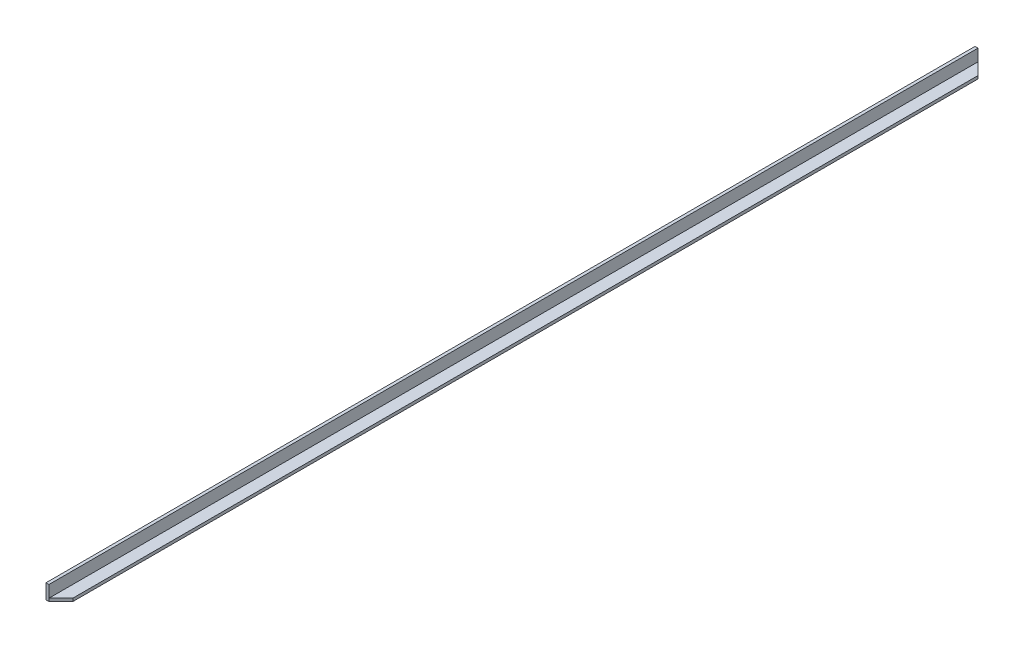
ISO-10303-21;
HEADER;
FILE_DESCRIPTION(('STEP AP214'),'2;1');
FILE_NAME('part.step','',(''),(''),'','','');
FILE_SCHEMA(('AUTOMOTIVE_DESIGN { 1 0 10303 214 1 1 1 1 }'));
ENDSEC;
DATA;
#1=APPLICATION_CONTEXT('core data for automotive mechanical design processes');
#2=APPLICATION_PROTOCOL_DEFINITION('international standard','automotive_design',2000,#1);
#3=PRODUCT_CONTEXT('',#1,'mechanical');
#4=PRODUCT('Part','Part','',(#3));
#5=PRODUCT_RELATED_PRODUCT_CATEGORY('part','',(#4));
#6=PRODUCT_DEFINITION_FORMATION('','',#4);
#7=PRODUCT_DEFINITION_CONTEXT('part definition',#1,'design');
#8=PRODUCT_DEFINITION('design','',#6,#7);
#9=PRODUCT_DEFINITION_SHAPE('','',#8);
#10=(LENGTH_UNIT() NAMED_UNIT(*) SI_UNIT(.MILLI.,.METRE.));
#11=(NAMED_UNIT(*) PLANE_ANGLE_UNIT() SI_UNIT($,.RADIAN.));
#12=(NAMED_UNIT(*) SI_UNIT($,.STERADIAN.) SOLID_ANGLE_UNIT());
#13=UNCERTAINTY_MEASURE_WITH_UNIT(LENGTH_MEASURE(1.E-05),#10,'distance_accuracy_value','');
#14=(GEOMETRIC_REPRESENTATION_CONTEXT(3) GLOBAL_UNCERTAINTY_ASSIGNED_CONTEXT((#13)) GLOBAL_UNIT_ASSIGNED_CONTEXT((#10,
#11,#12)) REPRESENTATION_CONTEXT('',''));
#15=CARTESIAN_POINT('',(0.,0.,0.));
#16=DIRECTION('',(0.,0.,1.));
#17=DIRECTION('',(1.,0.,0.));
#18=AXIS2_PLACEMENT_3D('',#15,#16,#17);
#19=CARTESIAN_POINT('',(-10.,0.,1250.));
#20=DIRECTION('',(1.,0.,0.));
#21=DIRECTION('',(0.,1.,0.));
#22=AXIS2_PLACEMENT_3D('',#19,#20,#21);
#23=PLANE('',#22);
#24=DIRECTION('',(0.,-1.,0.));
#25=VECTOR('',#24,1.);
#26=CARTESIAN_POINT('',(-10.,0.,0.));
#27=LINE('',#26,#25);
#28=CARTESIAN_POINT('',(-9.99999999999999,20.,0.));
#29=VERTEX_POINT('',#28);
#30=CARTESIAN_POINT('',(-10.,0.,0.));
#31=VERTEX_POINT('',#30);
#32=EDGE_CURVE('E133',#29,#31,#27,.T.);
#33=ORIENTED_EDGE('',*,*,#32,.T.);
#34=DIRECTION('',(0.,0.,-1.));
#35=VECTOR('',#34,1.);
#36=CARTESIAN_POINT('',(-10.,0.,1250.));
#37=LINE('',#36,#35);
#38=CARTESIAN_POINT('',(-10.,0.,1250.));
#39=VERTEX_POINT('',#38);
#40=EDGE_CURVE('E11',#39,#31,#37,.T.);
#41=ORIENTED_EDGE('',*,*,#40,.F.);
#42=DIRECTION('',(0.,-1.,0.));
#43=VECTOR('',#42,1.);
#44=CARTESIAN_POINT('',(-10.,0.,1250.));
#45=LINE('',#44,#43);
#46=CARTESIAN_POINT('',(-9.99999999999999,20.,1250.));
#47=VERTEX_POINT('',#46);
#48=EDGE_CURVE('E128',#47,#39,#45,.T.);
#49=ORIENTED_EDGE('',*,*,#48,.F.);
#50=DIRECTION('',(0.,0.,-1.));
#51=VECTOR('',#50,1.);
#52=CARTESIAN_POINT('',(-9.99999999999999,20.,1250.));
#53=LINE('',#52,#51);
#54=EDGE_CURVE('E125',#47,#29,#53,.T.);
#55=ORIENTED_EDGE('',*,*,#54,.T.);
#56=EDGE_LOOP('',(#33,#41,#49,#55));
#57=FACE_BOUND('',#56,.T.);
#58=ADVANCED_FACE('F33',(#57),#23,.F.);
#59=CARTESIAN_POINT('',(-10.,0.,1250.));
#60=DIRECTION('',(0.,1.,0.));
#61=DIRECTION('',(-1.,0.,0.));
#62=AXIS2_PLACEMENT_3D('',#59,#60,#61);
#63=PLANE('',#62);
#64=DIRECTION('',(0.,0.,-1.));
#65=VECTOR('',#64,1.);
#66=CARTESIAN_POINT('',(10.,0.,1250.));
#67=LINE('',#66,#65);
#68=CARTESIAN_POINT('',(10.,0.,1234.));
#69=VERTEX_POINT('',#68);
#70=CARTESIAN_POINT('',(10.,0.,16.));
#71=VERTEX_POINT('',#70);
#72=EDGE_CURVE('E40',#69,#71,#67,.T.);
#73=ORIENTED_EDGE('',*,*,#72,.F.);
#74=DIRECTION('',(-0.707106781186547,0.,0.707106781186548));
#75=VECTOR('',#74,1.);
#76=CARTESIAN_POINT('',(-6.,0.,1250.));
#77=LINE('',#76,#75);
#78=CARTESIAN_POINT('',(-6.,0.,1250.));
#79=VERTEX_POINT('',#78);
#80=EDGE_CURVE('E100',#69,#79,#77,.T.);
#81=ORIENTED_EDGE('',*,*,#80,.T.);
#82=DIRECTION('',(1.,0.,0.));
#83=VECTOR('',#82,1.);
#84=CARTESIAN_POINT('',(-10.,0.,1250.));
#85=LINE('',#84,#83);
#86=EDGE_CURVE('E81',#39,#79,#85,.T.);
#87=ORIENTED_EDGE('',*,*,#86,.F.);
#88=ORIENTED_EDGE('',*,*,#40,.T.);
#89=DIRECTION('',(1.,0.,0.));
#90=VECTOR('',#89,1.);
#91=CARTESIAN_POINT('',(-10.,0.,0.));
#92=LINE('',#91,#90);
#93=CARTESIAN_POINT('',(-6.,0.,0.));
#94=VERTEX_POINT('',#93);
#95=EDGE_CURVE('E131',#31,#94,#92,.T.);
#96=ORIENTED_EDGE('',*,*,#95,.T.);
#97=DIRECTION('',(0.707106781186548,0.,0.707106781186548));
#98=VECTOR('',#97,1.);
#99=CARTESIAN_POINT('',(-6.,0.,0.));
#100=LINE('',#99,#98);
#101=EDGE_CURVE('E47',#94,#71,#100,.T.);
#102=ORIENTED_EDGE('',*,*,#101,.T.);
#103=EDGE_LOOP('',(#73,#81,#87,#88,#96,#102));
#104=FACE_BOUND('',#103,.T.);
#105=ADVANCED_FACE('F116',(#104),#63,.F.);
#106=CARTESIAN_POINT('',(10.,4.,1250.));
#107=DIRECTION('',(-1.,0.,0.));
#108=DIRECTION('',(0.,0.,1.));
#109=AXIS2_PLACEMENT_3D('',#106,#107,#108);
#110=PLANE('',#109);
#111=DIRECTION('',(0.,0.,-1.));
#112=VECTOR('',#111,1.);
#113=CARTESIAN_POINT('',(10.,4.,1250.));
#114=LINE('',#113,#112);
#115=CARTESIAN_POINT('',(10.,4.,1234.));
#116=VERTEX_POINT('',#115);
#117=CARTESIAN_POINT('',(10.,4.,16.));
#118=VERTEX_POINT('',#117);
#119=EDGE_CURVE('E114',#116,#118,#114,.T.);
#120=ORIENTED_EDGE('',*,*,#119,.F.);
#121=DIRECTION('',(0.,1.,0.));
#122=VECTOR('',#121,1.);
#123=CARTESIAN_POINT('',(10.,0.,1234.));
#124=LINE('',#123,#122);
#125=EDGE_CURVE('E103',#69,#116,#124,.T.);
#126=ORIENTED_EDGE('',*,*,#125,.F.);
#127=ORIENTED_EDGE('',*,*,#72,.T.);
#128=DIRECTION('',(0.,1.,0.));
#129=VECTOR('',#128,1.);
#130=CARTESIAN_POINT('',(10.,0.,16.));
#131=LINE('',#130,#129);
#132=EDGE_CURVE('E136',#71,#118,#131,.T.);
#133=ORIENTED_EDGE('',*,*,#132,.T.);
#134=EDGE_LOOP('',(#120,#126,#127,#133));
#135=FACE_BOUND('',#134,.T.);
#136=ADVANCED_FACE('F112',(#135),#110,.F.);
#137=CARTESIAN_POINT('',(-6.,4.,1250.));
#138=DIRECTION('',(0.,-1.,0.));
#139=DIRECTION('',(0.,0.,-1.));
#140=AXIS2_PLACEMENT_3D('',#137,#138,#139);
#141=PLANE('',#140);
#142=DIRECTION('',(0.,0.,-1.));
#143=VECTOR('',#142,1.);
#144=CARTESIAN_POINT('',(-6.,4.,1250.));
#145=LINE('',#144,#143);
#146=CARTESIAN_POINT('',(-6.,4.,1250.));
#147=VERTEX_POINT('',#146);
#148=CARTESIAN_POINT('',(-6.,4.,0.));
#149=VERTEX_POINT('',#148);
#150=EDGE_CURVE('E118',#147,#149,#145,.T.);
#151=ORIENTED_EDGE('',*,*,#150,.F.);
#152=DIRECTION('',(-0.707106781186547,0.,0.707106781186548));
#153=VECTOR('',#152,1.);
#154=CARTESIAN_POINT('',(-6.,4.,1250.));
#155=LINE('',#154,#153);
#156=EDGE_CURVE('E108',#116,#147,#155,.T.);
#157=ORIENTED_EDGE('',*,*,#156,.F.);
#158=ORIENTED_EDGE('',*,*,#119,.T.);
#159=DIRECTION('',(0.707106781186548,0.,0.707106781186548));
#160=VECTOR('',#159,1.);
#161=CARTESIAN_POINT('',(-6.,4.,0.));
#162=LINE('',#161,#160);
#163=EDGE_CURVE('E145',#149,#118,#162,.T.);
#164=ORIENTED_EDGE('',*,*,#163,.F.);
#165=EDGE_LOOP('',(#151,#157,#158,#164));
#166=FACE_BOUND('',#165,.T.);
#167=ADVANCED_FACE('F156',(#166),#141,.F.);
#168=CARTESIAN_POINT('',(-6.,20.,1250.));
#169=DIRECTION('',(-1.,0.,0.));
#170=DIRECTION('',(0.,0.,1.));
#171=AXIS2_PLACEMENT_3D('',#168,#169,#170);
#172=PLANE('',#171);
#173=DIRECTION('',(0.,1.,0.));
#174=VECTOR('',#173,1.);
#175=CARTESIAN_POINT('',(-6.,20.,0.));
#176=LINE('',#175,#174);
#177=CARTESIAN_POINT('',(-6.,20.,0.));
#178=VERTEX_POINT('',#177);
#179=EDGE_CURVE('E129',#149,#178,#176,.T.);
#180=ORIENTED_EDGE('',*,*,#179,.T.);
#181=DIRECTION('',(0.,0.,-1.));
#182=VECTOR('',#181,1.);
#183=CARTESIAN_POINT('',(-6.,20.,1250.));
#184=LINE('',#183,#182);
#185=CARTESIAN_POINT('',(-6.,20.,1250.));
#186=VERTEX_POINT('',#185);
#187=EDGE_CURVE('E123',#186,#178,#184,.T.);
#188=ORIENTED_EDGE('',*,*,#187,.F.);
#189=DIRECTION('',(0.,1.,0.));
#190=VECTOR('',#189,1.);
#191=CARTESIAN_POINT('',(-6.,20.,1250.));
#192=LINE('',#191,#190);
#193=EDGE_CURVE('E138',#147,#186,#192,.T.);
#194=ORIENTED_EDGE('',*,*,#193,.F.);
#195=ORIENTED_EDGE('',*,*,#150,.T.);
#196=EDGE_LOOP('',(#180,#188,#194,#195));
#197=FACE_BOUND('',#196,.T.);
#198=ADVANCED_FACE('F159',(#197),#172,.F.);
#199=CARTESIAN_POINT('',(-9.99999999999999,20.,1250.));
#200=DIRECTION('',(0.,-1.,0.));
#201=DIRECTION('',(1.,0.,0.));
#202=AXIS2_PLACEMENT_3D('',#199,#200,#201);
#203=PLANE('',#202);
#204=DIRECTION('',(-1.,0.,0.));
#205=VECTOR('',#204,1.);
#206=CARTESIAN_POINT('',(-9.99999999999999,20.,0.));
#207=LINE('',#206,#205);
#208=EDGE_CURVE('E74',#178,#29,#207,.T.);
#209=ORIENTED_EDGE('',*,*,#208,.T.);
#210=ORIENTED_EDGE('',*,*,#54,.F.);
#211=DIRECTION('',(-1.,0.,0.));
#212=VECTOR('',#211,1.);
#213=CARTESIAN_POINT('',(-9.99999999999999,20.,1250.));
#214=LINE('',#213,#212);
#215=EDGE_CURVE('E56',#186,#47,#214,.T.);
#216=ORIENTED_EDGE('',*,*,#215,.F.);
#217=ORIENTED_EDGE('',*,*,#187,.T.);
#218=EDGE_LOOP('',(#209,#210,#216,#217));
#219=FACE_BOUND('',#218,.T.);
#220=ADVANCED_FACE('F160',(#219),#203,.F.);
#221=CARTESIAN_POINT('',(0.,0.,1250.));
#222=DIRECTION('',(0.,0.,-1.));
#223=DIRECTION('',(-1.,0.,0.));
#224=AXIS2_PLACEMENT_3D('',#221,#222,#223);
#225=PLANE('',#224);
#226=ORIENTED_EDGE('',*,*,#86,.T.);
#227=DIRECTION('',(0.,1.,0.));
#228=VECTOR('',#227,1.);
#229=CARTESIAN_POINT('',(-6.,0.,1250.));
#230=LINE('',#229,#228);
#231=EDGE_CURVE('E106',#79,#147,#230,.T.);
#232=ORIENTED_EDGE('',*,*,#231,.T.);
#233=ORIENTED_EDGE('',*,*,#193,.T.);
#234=ORIENTED_EDGE('',*,*,#215,.T.);
#235=ORIENTED_EDGE('',*,*,#48,.T.);
#236=EDGE_LOOP('',(#226,#232,#233,#234,#235));
#237=FACE_BOUND('',#236,.T.);
#238=ADVANCED_FACE('F152',(#237),#225,.F.);
#239=CARTESIAN_POINT('',(0.,0.,0.));
#240=DIRECTION('',(0.,0.,-1.));
#241=DIRECTION('',(-1.,0.,0.));
#242=AXIS2_PLACEMENT_3D('',#239,#240,#241);
#243=PLANE('',#242);
#244=DIRECTION('',(0.,1.,0.));
#245=VECTOR('',#244,1.);
#246=CARTESIAN_POINT('',(-6.,0.,0.));
#247=LINE('',#246,#245);
#248=EDGE_CURVE('E142',#94,#149,#247,.T.);
#249=ORIENTED_EDGE('',*,*,#248,.F.);
#250=ORIENTED_EDGE('',*,*,#95,.F.);
#251=ORIENTED_EDGE('',*,*,#32,.F.);
#252=ORIENTED_EDGE('',*,*,#208,.F.);
#253=ORIENTED_EDGE('',*,*,#179,.F.);
#254=EDGE_LOOP('',(#249,#250,#251,#252,#253));
#255=FACE_BOUND('',#254,.T.);
#256=ADVANCED_FACE('F166',(#255),#243,.T.);
#257=CARTESIAN_POINT('',(-6.,0.,0.));
#258=DIRECTION('',(-0.707106781186547,0.,0.707106781186547));
#259=DIRECTION('',(0.707106781186548,0.,0.707106781186548));
#260=AXIS2_PLACEMENT_3D('',#257,#258,#259);
#261=PLANE('',#260);
#262=ORIENTED_EDGE('',*,*,#163,.T.);
#263=ORIENTED_EDGE('',*,*,#132,.F.);
#264=ORIENTED_EDGE('',*,*,#101,.F.);
#265=ORIENTED_EDGE('',*,*,#248,.T.);
#266=EDGE_LOOP('',(#262,#263,#264,#265));
#267=FACE_BOUND('',#266,.T.);
#268=ADVANCED_FACE('F167',(#267),#261,.F.);
#269=CARTESIAN_POINT('',(-6.,0.,1250.));
#270=DIRECTION('',(-0.707106781186548,0.,-0.707106781186547));
#271=DIRECTION('',(-0.707106781186547,0.,0.707106781186548));
#272=AXIS2_PLACEMENT_3D('',#269,#270,#271);
#273=PLANE('',#272);
#274=ORIENTED_EDGE('',*,*,#156,.T.);
#275=ORIENTED_EDGE('',*,*,#231,.F.);
#276=ORIENTED_EDGE('',*,*,#80,.F.);
#277=ORIENTED_EDGE('',*,*,#125,.T.);
#278=EDGE_LOOP('',(#274,#275,#276,#277));
#279=FACE_BOUND('',#278,.T.);
#280=ADVANCED_FACE('F102',(#279),#273,.F.);
#281=CLOSED_SHELL('',(#58,#105,#136,#167,#198,#220,#238,#256,#268,#280));
#282=MANIFOLD_SOLID_BREP('B2',#281);
#283=ADVANCED_BREP_SHAPE_REPRESENTATION('',(#18,#282),#14);
#284=SHAPE_DEFINITION_REPRESENTATION(#9,#283);
ENDSEC;
END-ISO-10303-21;
